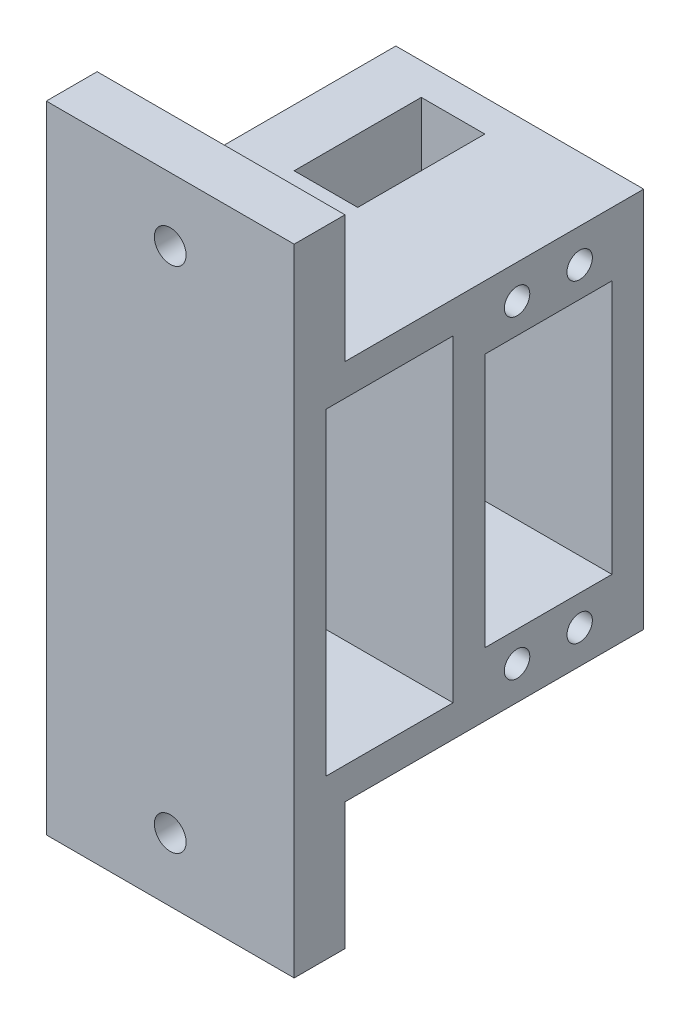
ISO-10303-21;
HEADER;
FILE_DESCRIPTION(('STEP AP214'),'2;1');
FILE_NAME('part.step','',(''),(''),'','','');
FILE_SCHEMA(('AUTOMOTIVE_DESIGN { 1 0 10303 214 1 1 1 1 }'));
ENDSEC;
DATA;
#1=APPLICATION_CONTEXT('core data for automotive mechanical design processes');
#2=APPLICATION_PROTOCOL_DEFINITION('international standard','automotive_design',2000,#1);
#3=PRODUCT_CONTEXT('',#1,'mechanical');
#4=PRODUCT('Part','Part','',(#3));
#5=PRODUCT_RELATED_PRODUCT_CATEGORY('part','',(#4));
#6=PRODUCT_DEFINITION_FORMATION('','',#4);
#7=PRODUCT_DEFINITION_CONTEXT('part definition',#1,'design');
#8=PRODUCT_DEFINITION('design','',#6,#7);
#9=PRODUCT_DEFINITION_SHAPE('','',#8);
#10=(LENGTH_UNIT() NAMED_UNIT(*) SI_UNIT(.MILLI.,.METRE.));
#11=(NAMED_UNIT(*) PLANE_ANGLE_UNIT() SI_UNIT($,.RADIAN.));
#12=(NAMED_UNIT(*) SI_UNIT($,.STERADIAN.) SOLID_ANGLE_UNIT());
#13=UNCERTAINTY_MEASURE_WITH_UNIT(LENGTH_MEASURE(1.E-05),#10,'distance_accuracy_value','');
#14=(GEOMETRIC_REPRESENTATION_CONTEXT(3) GLOBAL_UNCERTAINTY_ASSIGNED_CONTEXT((#13)) GLOBAL_UNIT_ASSIGNED_CONTEXT((#10,
#11,#12)) REPRESENTATION_CONTEXT('',''));
#15=CARTESIAN_POINT('',(0.,0.,0.));
#16=DIRECTION('',(0.,0.,1.));
#17=DIRECTION('',(1.,0.,0.));
#18=AXIS2_PLACEMENT_3D('',#15,#16,#17);
#19=CARTESIAN_POINT('',(39.,30.,15.));
#20=DIRECTION('',(0.,-1.,0.));
#21=DIRECTION('',(0.,0.,-1.));
#22=AXIS2_PLACEMENT_3D('',#19,#20,#21);
#23=PLANE('',#22);
#24=DIRECTION('',(1.,0.,0.));
#25=VECTOR('',#24,1.);
#26=CARTESIAN_POINT('',(9.,30.,10.));
#27=LINE('',#26,#25);
#28=CARTESIAN_POINT('',(9.,30.,10.));
#29=VERTEX_POINT('',#28);
#30=CARTESIAN_POINT('',(19.,30.,10.));
#31=VERTEX_POINT('',#30);
#32=EDGE_CURVE('E251',#29,#31,#27,.T.);
#33=ORIENTED_EDGE('',*,*,#32,.F.);
#34=DIRECTION('',(0.,0.,1.));
#35=VECTOR('',#34,1.);
#36=CARTESIAN_POINT('',(9.,30.,10.));
#37=LINE('',#36,#35);
#38=CARTESIAN_POINT('',(9.,30.,-9.99999999999999));
#39=VERTEX_POINT('',#38);
#40=EDGE_CURVE('E254',#39,#29,#37,.T.);
#41=ORIENTED_EDGE('',*,*,#40,.F.);
#42=DIRECTION('',(-1.,0.,0.));
#43=VECTOR('',#42,1.);
#44=CARTESIAN_POINT('',(9.,30.,-9.99999999999999));
#45=LINE('',#44,#43);
#46=CARTESIAN_POINT('',(19.,30.,-9.99999999999999));
#47=VERTEX_POINT('',#46);
#48=EDGE_CURVE('E257',#47,#39,#45,.T.);
#49=ORIENTED_EDGE('',*,*,#48,.F.);
#50=DIRECTION('',(0.,0.,-1.));
#51=VECTOR('',#50,1.);
#52=CARTESIAN_POINT('',(19.,30.,10.));
#53=LINE('',#52,#51);
#54=EDGE_CURVE('E248',#31,#47,#53,.T.);
#55=ORIENTED_EDGE('',*,*,#54,.F.);
#56=EDGE_LOOP('',(#33,#41,#49,#55));
#57=FACE_BOUND('',#56,.T.);
#58=DIRECTION('',(-1.,0.,0.));
#59=VECTOR('',#58,1.);
#60=CARTESIAN_POINT('',(39.,30.,32.));
#61=LINE('',#60,#59);
#62=CARTESIAN_POINT('',(39.,30.,32.));
#63=VERTEX_POINT('',#62);
#64=CARTESIAN_POINT('',(0.,30.,32.));
#65=VERTEX_POINT('',#64);
#66=EDGE_CURVE('E60',#63,#65,#61,.T.);
#67=ORIENTED_EDGE('',*,*,#66,.F.);
#68=DIRECTION('',(0.,0.,1.));
#69=VECTOR('',#68,1.);
#70=CARTESIAN_POINT('',(39.,30.,15.));
#71=LINE('',#70,#69);
#72=CARTESIAN_POINT('',(39.,30.,-15.));
#73=VERTEX_POINT('',#72);
#74=EDGE_CURVE('E192',#73,#63,#71,.T.);
#75=ORIENTED_EDGE('',*,*,#74,.F.);
#76=DIRECTION('',(-1.,0.,0.));
#77=VECTOR('',#76,1.);
#78=CARTESIAN_POINT('',(39.,30.,-15.));
#79=LINE('',#78,#77);
#80=CARTESIAN_POINT('',(0.,30.,-15.));
#81=VERTEX_POINT('',#80);
#82=EDGE_CURVE('E13',#73,#81,#79,.T.);
#83=ORIENTED_EDGE('',*,*,#82,.T.);
#84=DIRECTION('',(0.,0.,1.));
#85=VECTOR('',#84,1.);
#86=CARTESIAN_POINT('',(0.,30.,15.));
#87=LINE('',#86,#85);
#88=EDGE_CURVE('E326',#81,#65,#87,.T.);
#89=ORIENTED_EDGE('',*,*,#88,.T.);
#90=EDGE_LOOP('',(#67,#75,#83,#89));
#91=FACE_BOUND('',#90,.T.);
#92=ADVANCED_FACE('F45',(#57,#91),#23,.F.);
#93=CARTESIAN_POINT('',(39.,-30.,15.));
#94=DIRECTION('',(0.,1.,0.));
#95=DIRECTION('',(0.,0.,1.));
#96=AXIS2_PLACEMENT_3D('',#93,#94,#95);
#97=PLANE('',#96);
#98=DIRECTION('',(1.,0.,0.));
#99=VECTOR('',#98,1.);
#100=CARTESIAN_POINT('',(39.,-30.,32.));
#101=LINE('',#100,#99);
#102=CARTESIAN_POINT('',(0.,-30.,32.));
#103=VERTEX_POINT('',#102);
#104=CARTESIAN_POINT('',(39.,-30.,32.));
#105=VERTEX_POINT('',#104);
#106=EDGE_CURVE('E68',#103,#105,#101,.T.);
#107=ORIENTED_EDGE('',*,*,#106,.F.);
#108=DIRECTION('',(0.,0.,-1.));
#109=VECTOR('',#108,1.);
#110=CARTESIAN_POINT('',(0.,-30.,15.));
#111=LINE('',#110,#109);
#112=CARTESIAN_POINT('',(0.,-30.,-15.));
#113=VERTEX_POINT('',#112);
#114=EDGE_CURVE('E320',#103,#113,#111,.T.);
#115=ORIENTED_EDGE('',*,*,#114,.T.);
#116=DIRECTION('',(-1.,0.,0.));
#117=VECTOR('',#116,1.);
#118=CARTESIAN_POINT('',(39.,-30.,-15.));
#119=LINE('',#118,#117);
#120=CARTESIAN_POINT('',(39.,-30.,-15.));
#121=VERTEX_POINT('',#120);
#122=EDGE_CURVE('E53',#121,#113,#119,.T.);
#123=ORIENTED_EDGE('',*,*,#122,.F.);
#124=DIRECTION('',(0.,0.,-1.));
#125=VECTOR('',#124,1.);
#126=CARTESIAN_POINT('',(39.,-30.,15.));
#127=LINE('',#126,#125);
#128=EDGE_CURVE('E322',#105,#121,#127,.T.);
#129=ORIENTED_EDGE('',*,*,#128,.F.);
#130=EDGE_LOOP('',(#107,#115,#123,#129));
#131=FACE_BOUND('',#130,.T.);
#132=ADVANCED_FACE('F339',(#131),#97,.F.);
#133=CARTESIAN_POINT('',(39.,30.,-15.));
#134=DIRECTION('',(0.,0.,1.));
#135=DIRECTION('',(0.,-1.,0.));
#136=AXIS2_PLACEMENT_3D('',#133,#134,#135);
#137=PLANE('',#136);
#138=DIRECTION('',(0.,1.,0.));
#139=VECTOR('',#138,1.);
#140=CARTESIAN_POINT('',(0.,30.,-15.));
#141=LINE('',#140,#139);
#142=EDGE_CURVE('E312',#113,#81,#141,.T.);
#143=ORIENTED_EDGE('',*,*,#142,.T.);
#144=ORIENTED_EDGE('',*,*,#82,.F.);
#145=DIRECTION('',(0.,1.,0.));
#146=VECTOR('',#145,1.);
#147=CARTESIAN_POINT('',(39.,30.,-15.));
#148=LINE('',#147,#146);
#149=EDGE_CURVE('E318',#121,#73,#148,.T.);
#150=ORIENTED_EDGE('',*,*,#149,.F.);
#151=ORIENTED_EDGE('',*,*,#122,.T.);
#152=EDGE_LOOP('',(#143,#144,#150,#151));
#153=FACE_BOUND('',#152,.T.);
#154=ADVANCED_FACE('F47',(#153),#137,.F.);
#155=CARTESIAN_POINT('',(39.,0.,0.));
#156=DIRECTION('',(1.,0.,0.));
#157=DIRECTION('',(0.,0.,-1.));
#158=AXIS2_PLACEMENT_3D('',#155,#156,#157);
#159=PLANE('',#158);
#160=DIRECTION('',(0.,-1.,0.));
#161=VECTOR('',#160,1.);
#162=CARTESIAN_POINT('',(39.,25.,35.));
#163=LINE('',#162,#161);
#164=CARTESIAN_POINT('',(39.,25.,35.));
#165=VERTEX_POINT('',#164);
#166=CARTESIAN_POINT('',(39.,-25.,35.));
#167=VERTEX_POINT('',#166);
#168=EDGE_CURVE('E214',#165,#167,#163,.T.);
#169=ORIENTED_EDGE('',*,*,#168,.F.);
#170=DIRECTION('',(0.,0.,1.));
#171=VECTOR('',#170,1.);
#172=CARTESIAN_POINT('',(39.,25.,35.));
#173=LINE('',#172,#171);
#174=CARTESIAN_POINT('',(39.,25.,15.));
#175=VERTEX_POINT('',#174);
#176=EDGE_CURVE('E231',#175,#165,#173,.T.);
#177=ORIENTED_EDGE('',*,*,#176,.F.);
#178=DIRECTION('',(0.,1.,0.));
#179=VECTOR('',#178,1.);
#180=CARTESIAN_POINT('',(39.,25.,15.));
#181=LINE('',#180,#179);
#182=CARTESIAN_POINT('',(39.,-25.,15.));
#183=VERTEX_POINT('',#182);
#184=EDGE_CURVE('E228',#183,#175,#181,.T.);
#185=ORIENTED_EDGE('',*,*,#184,.F.);
#186=DIRECTION('',(0.,0.,-1.));
#187=VECTOR('',#186,1.);
#188=CARTESIAN_POINT('',(39.,-25.,35.));
#189=LINE('',#188,#187);
#190=EDGE_CURVE('E225',#167,#183,#189,.T.);
#191=ORIENTED_EDGE('',*,*,#190,.F.);
#192=EDGE_LOOP('',(#169,#177,#185,#191));
#193=FACE_BOUND('',#192,.T.);
#194=CARTESIAN_POINT('',(39.,-24.71,4.925));
#195=DIRECTION('',(1.,0.,0.));
#196=DIRECTION('',(0.,0.,1.));
#197=AXIS2_PLACEMENT_3D('',#194,#195,#196);
#198=CIRCLE('',#197,2.);
#199=CARTESIAN_POINT('',(39.,-24.71,6.925));
#200=VERTEX_POINT('',#199);
#201=EDGE_CURVE('E282',#200,#200,#198,.T.);
#202=ORIENTED_EDGE('',*,*,#201,.F.);
#203=EDGE_LOOP('',(#202));
#204=FACE_BOUND('',#203,.T.);
#205=CARTESIAN_POINT('',(39.,-24.71,-4.925));
#206=DIRECTION('',(1.,0.,0.));
#207=DIRECTION('',(0.,0.,1.));
#208=AXIS2_PLACEMENT_3D('',#205,#206,#207);
#209=CIRCLE('',#208,2.);
#210=CARTESIAN_POINT('',(39.,-24.71,-2.925));
#211=VERTEX_POINT('',#210);
#212=EDGE_CURVE('E276',#211,#211,#209,.T.);
#213=ORIENTED_EDGE('',*,*,#212,.F.);
#214=EDGE_LOOP('',(#213));
#215=FACE_BOUND('',#214,.T.);
#216=CARTESIAN_POINT('',(39.,24.71,-4.925));
#217=DIRECTION('',(1.,0.,0.));
#218=DIRECTION('',(0.,0.,-1.));
#219=AXIS2_PLACEMENT_3D('',#216,#217,#218);
#220=CIRCLE('',#219,2.00000000000001);
#221=CARTESIAN_POINT('',(39.,24.71,-6.92500000000001));
#222=VERTEX_POINT('',#221);
#223=EDGE_CURVE('E269',#222,#222,#220,.T.);
#224=ORIENTED_EDGE('',*,*,#223,.F.);
#225=EDGE_LOOP('',(#224));
#226=FACE_BOUND('',#225,.T.);
#227=CARTESIAN_POINT('',(39.,24.71,4.925));
#228=DIRECTION('',(1.,0.,0.));
#229=DIRECTION('',(0.,0.,-1.));
#230=AXIS2_PLACEMENT_3D('',#227,#228,#229);
#231=CIRCLE('',#230,2.);
#232=CARTESIAN_POINT('',(39.,24.71,2.92499999999999));
#233=VERTEX_POINT('',#232);
#234=EDGE_CURVE('E272',#233,#233,#231,.T.);
#235=ORIENTED_EDGE('',*,*,#234,.F.);
#236=EDGE_LOOP('',(#235));
#237=FACE_BOUND('',#236,.T.);
#238=DIRECTION('',(0.,1.,0.));
#239=VECTOR('',#238,1.);
#240=CARTESIAN_POINT('',(39.,20.,-9.99999999999999));
#241=LINE('',#240,#239);
#242=CARTESIAN_POINT('',(39.,-20.,-10.));
#243=VERTEX_POINT('',#242);
#244=CARTESIAN_POINT('',(39.,20.,-9.99999999999999));
#245=VERTEX_POINT('',#244);
#246=EDGE_CURVE('E289',#243,#245,#241,.T.);
#247=ORIENTED_EDGE('',*,*,#246,.F.);
#248=DIRECTION('',(0.,0.,-1.));
#249=VECTOR('',#248,1.);
#250=CARTESIAN_POINT('',(39.,-20.,10.));
#251=LINE('',#250,#249);
#252=CARTESIAN_POINT('',(39.,-20.,10.));
#253=VERTEX_POINT('',#252);
#254=EDGE_CURVE('E293',#253,#243,#251,.T.);
#255=ORIENTED_EDGE('',*,*,#254,.F.);
#256=DIRECTION('',(0.,-1.,0.));
#257=VECTOR('',#256,1.);
#258=CARTESIAN_POINT('',(39.,20.,10.));
#259=LINE('',#258,#257);
#260=CARTESIAN_POINT('',(39.,20.,10.));
#261=VERTEX_POINT('',#260);
#262=EDGE_CURVE('E305',#261,#253,#259,.T.);
#263=ORIENTED_EDGE('',*,*,#262,.F.);
#264=DIRECTION('',(0.,0.,1.));
#265=VECTOR('',#264,1.);
#266=CARTESIAN_POINT('',(39.,20.,10.));
#267=LINE('',#266,#265);
#268=EDGE_CURVE('E302',#245,#261,#267,.T.);
#269=ORIENTED_EDGE('',*,*,#268,.F.);
#270=EDGE_LOOP('',(#247,#255,#263,#269));
#271=FACE_BOUND('',#270,.T.);
#272=ORIENTED_EDGE('',*,*,#149,.T.);
#273=ORIENTED_EDGE('',*,*,#74,.T.);
#274=DIRECTION('',(0.,-1.,0.));
#275=VECTOR('',#274,1.);
#276=CARTESIAN_POINT('',(39.,50.,32.));
#277=LINE('',#276,#275);
#278=CARTESIAN_POINT('',(39.,50.,32.));
#279=VERTEX_POINT('',#278);
#280=EDGE_CURVE('E174',#279,#63,#277,.T.);
#281=ORIENTED_EDGE('',*,*,#280,.F.);
#282=DIRECTION('',(0.,0.,-1.));
#283=VECTOR('',#282,1.);
#284=CARTESIAN_POINT('',(39.,50.,40.));
#285=LINE('',#284,#283);
#286=CARTESIAN_POINT('',(39.,50.,40.));
#287=VERTEX_POINT('',#286);
#288=EDGE_CURVE('E181',#287,#279,#285,.T.);
#289=ORIENTED_EDGE('',*,*,#288,.F.);
#290=DIRECTION('',(0.,1.,0.));
#291=VECTOR('',#290,1.);
#292=CARTESIAN_POINT('',(39.,30.,40.));
#293=LINE('',#292,#291);
#294=CARTESIAN_POINT('',(39.,-50.,40.));
#295=VERTEX_POINT('',#294);
#296=EDGE_CURVE('E245',#295,#287,#293,.T.);
#297=ORIENTED_EDGE('',*,*,#296,.F.);
#298=DIRECTION('',(0.,0.,1.));
#299=VECTOR('',#298,1.);
#300=CARTESIAN_POINT('',(39.,-50.,32.));
#301=LINE('',#300,#299);
#302=CARTESIAN_POINT('',(39.,-50.,32.));
#303=VERTEX_POINT('',#302);
#304=EDGE_CURVE('E194',#303,#295,#301,.T.);
#305=ORIENTED_EDGE('',*,*,#304,.F.);
#306=DIRECTION('',(0.,1.,0.));
#307=VECTOR('',#306,1.);
#308=CARTESIAN_POINT('',(39.,-50.,32.));
#309=LINE('',#308,#307);
#310=EDGE_CURVE('E207',#303,#105,#309,.T.);
#311=ORIENTED_EDGE('',*,*,#310,.T.);
#312=ORIENTED_EDGE('',*,*,#128,.T.);
#313=EDGE_LOOP('',(#272,#273,#281,#289,#297,#305,#311,#312));
#314=FACE_BOUND('',#313,.T.);
#315=ADVANCED_FACE('F191',(#193,#204,#215,#226,#237,#271,#314),#159,.T.);
#316=CARTESIAN_POINT('',(0.,0.,0.));
#317=DIRECTION('',(1.,0.,0.));
#318=DIRECTION('',(0.,0.,-1.));
#319=AXIS2_PLACEMENT_3D('',#316,#317,#318);
#320=PLANE('',#319);
#321=DIRECTION('',(0.,0.,-1.));
#322=VECTOR('',#321,1.);
#323=CARTESIAN_POINT('',(0.,25.,35.));
#324=LINE('',#323,#322);
#325=CARTESIAN_POINT('',(0.,25.,35.));
#326=VERTEX_POINT('',#325);
#327=CARTESIAN_POINT('',(0.,25.,15.));
#328=VERTEX_POINT('',#327);
#329=EDGE_CURVE('E218',#326,#328,#324,.T.);
#330=ORIENTED_EDGE('',*,*,#329,.F.);
#331=DIRECTION('',(0.,1.,0.));
#332=VECTOR('',#331,1.);
#333=CARTESIAN_POINT('',(0.,25.,35.));
#334=LINE('',#333,#332);
#335=CARTESIAN_POINT('',(0.,-25.,35.));
#336=VERTEX_POINT('',#335);
#337=EDGE_CURVE('E221',#336,#326,#334,.T.);
#338=ORIENTED_EDGE('',*,*,#337,.F.);
#339=DIRECTION('',(0.,0.,1.));
#340=VECTOR('',#339,1.);
#341=CARTESIAN_POINT('',(0.,-25.,35.));
#342=LINE('',#341,#340);
#343=CARTESIAN_POINT('',(0.,-25.,15.));
#344=VERTEX_POINT('',#343);
#345=EDGE_CURVE('E223',#344,#336,#342,.T.);
#346=ORIENTED_EDGE('',*,*,#345,.F.);
#347=DIRECTION('',(0.,-1.,0.));
#348=VECTOR('',#347,1.);
#349=CARTESIAN_POINT('',(0.,25.,15.));
#350=LINE('',#349,#348);
#351=EDGE_CURVE('E215',#328,#344,#350,.T.);
#352=ORIENTED_EDGE('',*,*,#351,.F.);
#353=EDGE_LOOP('',(#330,#338,#346,#352));
#354=FACE_BOUND('',#353,.T.);
#355=ORIENTED_EDGE('',*,*,#142,.F.);
#356=ORIENTED_EDGE('',*,*,#114,.F.);
#357=DIRECTION('',(0.,1.,0.));
#358=VECTOR('',#357,1.);
#359=CARTESIAN_POINT('',(0.,-50.,32.));
#360=LINE('',#359,#358);
#361=CARTESIAN_POINT('',(0.,-50.,32.));
#362=VERTEX_POINT('',#361);
#363=EDGE_CURVE('E211',#362,#103,#360,.T.);
#364=ORIENTED_EDGE('',*,*,#363,.F.);
#365=DIRECTION('',(0.,0.,-1.));
#366=VECTOR('',#365,1.);
#367=CARTESIAN_POINT('',(0.,-50.,32.));
#368=LINE('',#367,#366);
#369=CARTESIAN_POINT('',(0.,-50.,40.));
#370=VERTEX_POINT('',#369);
#371=EDGE_CURVE('E204',#370,#362,#368,.T.);
#372=ORIENTED_EDGE('',*,*,#371,.F.);
#373=DIRECTION('',(0.,-1.,0.));
#374=VECTOR('',#373,1.);
#375=CARTESIAN_POINT('',(0.,30.,40.));
#376=LINE('',#375,#374);
#377=CARTESIAN_POINT('',(0.,50.,40.));
#378=VERTEX_POINT('',#377);
#379=EDGE_CURVE('E243',#378,#370,#376,.T.);
#380=ORIENTED_EDGE('',*,*,#379,.F.);
#381=DIRECTION('',(0.,0.,1.));
#382=VECTOR('',#381,1.);
#383=CARTESIAN_POINT('',(0.,50.,40.));
#384=LINE('',#383,#382);
#385=CARTESIAN_POINT('',(0.,50.,32.));
#386=VERTEX_POINT('',#385);
#387=EDGE_CURVE('E180',#386,#378,#384,.T.);
#388=ORIENTED_EDGE('',*,*,#387,.F.);
#389=DIRECTION('',(0.,-1.,0.));
#390=VECTOR('',#389,1.);
#391=CARTESIAN_POINT('',(0.,50.,32.));
#392=LINE('',#391,#390);
#393=EDGE_CURVE('E176',#386,#65,#392,.T.);
#394=ORIENTED_EDGE('',*,*,#393,.T.);
#395=ORIENTED_EDGE('',*,*,#88,.F.);
#396=EDGE_LOOP('',(#355,#356,#364,#372,#380,#388,#394,#395));
#397=FACE_BOUND('',#396,.T.);
#398=ADVANCED_FACE('F335',(#354,#397),#320,.F.);
#399=CARTESIAN_POINT('',(9.,20.,-9.99999999999999));
#400=DIRECTION('',(0.,0.,-1.));
#401=DIRECTION('',(0.,1.,0.));
#402=AXIS2_PLACEMENT_3D('',#399,#400,#401);
#403=PLANE('',#402);
#404=ORIENTED_EDGE('',*,*,#246,.T.);
#405=DIRECTION('',(1.,0.,0.));
#406=VECTOR('',#405,1.);
#407=CARTESIAN_POINT('',(9.,20.,-9.99999999999999));
#408=LINE('',#407,#406);
#409=CARTESIAN_POINT('',(19.,20.,-9.99999999999999));
#410=VERTEX_POINT('',#409);
#411=EDGE_CURVE('E299',#410,#245,#408,.T.);
#412=ORIENTED_EDGE('',*,*,#411,.F.);
#413=DIRECTION('',(0.,-1.,0.));
#414=VECTOR('',#413,1.);
#415=CARTESIAN_POINT('',(19.,52.3606797749979,-9.99999999999999));
#416=LINE('',#415,#414);
#417=EDGE_CURVE('E260',#47,#410,#416,.T.);
#418=ORIENTED_EDGE('',*,*,#417,.F.);
#419=ORIENTED_EDGE('',*,*,#48,.T.);
#420=DIRECTION('',(0.,1.,0.));
#421=VECTOR('',#420,1.);
#422=CARTESIAN_POINT('',(9.,20.,-9.99999999999999));
#423=LINE('',#422,#421);
#424=CARTESIAN_POINT('',(9.,-20.,-10.));
#425=VERTEX_POINT('',#424);
#426=EDGE_CURVE('E290',#425,#39,#423,.T.);
#427=ORIENTED_EDGE('',*,*,#426,.F.);
#428=DIRECTION('',(1.,0.,0.));
#429=VECTOR('',#428,1.);
#430=CARTESIAN_POINT('',(9.,-20.,-10.));
#431=LINE('',#430,#429);
#432=EDGE_CURVE('E310',#425,#243,#431,.T.);
#433=ORIENTED_EDGE('',*,*,#432,.T.);
#434=EDGE_LOOP('',(#404,#412,#418,#419,#427,#433));
#435=FACE_BOUND('',#434,.T.);
#436=ADVANCED_FACE('F391',(#435),#403,.F.);
#437=CARTESIAN_POINT('',(9.,-20.,10.));
#438=DIRECTION('',(0.,-1.,0.));
#439=DIRECTION('',(0.,0.,-1.));
#440=AXIS2_PLACEMENT_3D('',#437,#438,#439);
#441=PLANE('',#440);
#442=ORIENTED_EDGE('',*,*,#254,.T.);
#443=ORIENTED_EDGE('',*,*,#432,.F.);
#444=DIRECTION('',(0.,0.,-1.));
#445=VECTOR('',#444,1.);
#446=CARTESIAN_POINT('',(9.,-20.,10.));
#447=LINE('',#446,#445);
#448=CARTESIAN_POINT('',(9.,-20.,10.));
#449=VERTEX_POINT('',#448);
#450=EDGE_CURVE('E296',#449,#425,#447,.T.);
#451=ORIENTED_EDGE('',*,*,#450,.F.);
#452=DIRECTION('',(1.,0.,0.));
#453=VECTOR('',#452,1.);
#454=CARTESIAN_POINT('',(9.,-20.,10.));
#455=LINE('',#454,#453);
#456=EDGE_CURVE('E313',#449,#253,#455,.T.);
#457=ORIENTED_EDGE('',*,*,#456,.T.);
#458=EDGE_LOOP('',(#442,#443,#451,#457));
#459=FACE_BOUND('',#458,.T.);
#460=ADVANCED_FACE('F398',(#459),#441,.F.);
#461=CARTESIAN_POINT('',(9.,20.,10.));
#462=DIRECTION('',(0.,0.,1.));
#463=DIRECTION('',(0.,-1.,0.));
#464=AXIS2_PLACEMENT_3D('',#461,#462,#463);
#465=PLANE('',#464);
#466=ORIENTED_EDGE('',*,*,#262,.T.);
#467=ORIENTED_EDGE('',*,*,#456,.F.);
#468=DIRECTION('',(0.,-1.,0.));
#469=VECTOR('',#468,1.);
#470=CARTESIAN_POINT('',(9.,20.,10.));
#471=LINE('',#470,#469);
#472=EDGE_CURVE('E292',#29,#449,#471,.T.);
#473=ORIENTED_EDGE('',*,*,#472,.F.);
#474=ORIENTED_EDGE('',*,*,#32,.T.);
#475=DIRECTION('',(0.,-1.,0.));
#476=VECTOR('',#475,1.);
#477=CARTESIAN_POINT('',(19.,52.3606797749979,10.));
#478=LINE('',#477,#476);
#479=CARTESIAN_POINT('',(19.,20.,10.));
#480=VERTEX_POINT('',#479);
#481=EDGE_CURVE('E252',#31,#480,#478,.T.);
#482=ORIENTED_EDGE('',*,*,#481,.T.);
#483=DIRECTION('',(1.,0.,0.));
#484=VECTOR('',#483,1.);
#485=CARTESIAN_POINT('',(9.,20.,10.));
#486=LINE('',#485,#484);
#487=EDGE_CURVE('E315',#480,#261,#486,.T.);
#488=ORIENTED_EDGE('',*,*,#487,.T.);
#489=EDGE_LOOP('',(#466,#467,#473,#474,#482,#488));
#490=FACE_BOUND('',#489,.T.);
#491=ADVANCED_FACE('F404',(#490),#465,.F.);
#492=CARTESIAN_POINT('',(9.,20.,10.));
#493=DIRECTION('',(0.,1.,0.));
#494=DIRECTION('',(0.,0.,1.));
#495=AXIS2_PLACEMENT_3D('',#492,#493,#494);
#496=PLANE('',#495);
#497=ORIENTED_EDGE('',*,*,#487,.F.);
#498=DIRECTION('',(0.,0.,1.));
#499=VECTOR('',#498,1.);
#500=CARTESIAN_POINT('',(19.,20.,10.));
#501=LINE('',#500,#499);
#502=EDGE_CURVE('E247',#410,#480,#501,.T.);
#503=ORIENTED_EDGE('',*,*,#502,.F.);
#504=ORIENTED_EDGE('',*,*,#411,.T.);
#505=ORIENTED_EDGE('',*,*,#268,.T.);
#506=EDGE_LOOP('',(#497,#503,#504,#505));
#507=FACE_BOUND('',#506,.T.);
#508=ADVANCED_FACE('F400',(#507),#496,.F.);
#509=CARTESIAN_POINT('',(9.,0.,0.));
#510=DIRECTION('',(1.,0.,0.));
#511=DIRECTION('',(0.,0.,-1.));
#512=AXIS2_PLACEMENT_3D('',#509,#510,#511);
#513=PLANE('',#512);
#514=ORIENTED_EDGE('',*,*,#426,.T.);
#515=ORIENTED_EDGE('',*,*,#40,.T.);
#516=ORIENTED_EDGE('',*,*,#472,.T.);
#517=ORIENTED_EDGE('',*,*,#450,.T.);
#518=EDGE_LOOP('',(#514,#515,#516,#517));
#519=FACE_BOUND('',#518,.T.);
#520=ADVANCED_FACE('F403',(#519),#513,.T.);
#521=CARTESIAN_POINT('',(19.,24.71,4.925));
#522=DIRECTION('',(1.,0.,0.));
#523=DIRECTION('',(0.,0.,-1.));
#524=AXIS2_PLACEMENT_3D('',#521,#522,#523);
#525=CYLINDRICAL_SURFACE('',#524,2.);
#526=CARTESIAN_POINT('',(19.,24.71,4.925));
#527=DIRECTION('',(1.,0.,0.));
#528=DIRECTION('',(0.,0.,-1.));
#529=AXIS2_PLACEMENT_3D('',#526,#527,#528);
#530=CIRCLE('',#529,2.);
#531=CARTESIAN_POINT('',(19.,24.71,2.92499999999999));
#532=VERTEX_POINT('',#531);
#533=EDGE_CURVE('E268',#532,#532,#530,.T.);
#534=ORIENTED_EDGE('',*,*,#533,.F.);
#535=EDGE_LOOP('',(#534));
#536=FACE_BOUND('',#535,.T.);
#537=ORIENTED_EDGE('',*,*,#234,.T.);
#538=EDGE_LOOP('',(#537));
#539=FACE_BOUND('',#538,.T.);
#540=ADVANCED_FACE('F414',(#536,#539),#525,.F.);
#541=CARTESIAN_POINT('',(19.,24.71,-4.925));
#542=DIRECTION('',(1.,0.,0.));
#543=DIRECTION('',(0.,0.,-1.));
#544=AXIS2_PLACEMENT_3D('',#541,#542,#543);
#545=CYLINDRICAL_SURFACE('',#544,2.00000000000001);
#546=CARTESIAN_POINT('',(19.,24.71,-4.925));
#547=DIRECTION('',(1.,0.,0.));
#548=DIRECTION('',(0.,0.,-1.));
#549=AXIS2_PLACEMENT_3D('',#546,#547,#548);
#550=CIRCLE('',#549,2.00000000000001);
#551=CARTESIAN_POINT('',(19.,24.71,-6.92500000000001));
#552=VERTEX_POINT('',#551);
#553=EDGE_CURVE('E265',#552,#552,#550,.T.);
#554=ORIENTED_EDGE('',*,*,#553,.F.);
#555=EDGE_LOOP('',(#554));
#556=FACE_BOUND('',#555,.T.);
#557=ORIENTED_EDGE('',*,*,#223,.T.);
#558=EDGE_LOOP('',(#557));
#559=FACE_BOUND('',#558,.T.);
#560=ADVANCED_FACE('F418',(#556,#559),#545,.F.);
#561=CARTESIAN_POINT('',(19.,-24.71,-4.925));
#562=DIRECTION('',(1.,0.,0.));
#563=DIRECTION('',(0.,0.,-1.));
#564=AXIS2_PLACEMENT_3D('',#561,#562,#563);
#565=CYLINDRICAL_SURFACE('',#564,2.);
#566=CARTESIAN_POINT('',(19.,-24.71,-4.925));
#567=DIRECTION('',(1.,0.,0.));
#568=DIRECTION('',(0.,0.,1.));
#569=AXIS2_PLACEMENT_3D('',#566,#567,#568);
#570=CIRCLE('',#569,2.);
#571=CARTESIAN_POINT('',(19.,-24.71,-2.925));
#572=VERTEX_POINT('',#571);
#573=EDGE_CURVE('E273',#572,#572,#570,.T.);
#574=ORIENTED_EDGE('',*,*,#573,.F.);
#575=EDGE_LOOP('',(#574));
#576=FACE_BOUND('',#575,.T.);
#577=ORIENTED_EDGE('',*,*,#212,.T.);
#578=EDGE_LOOP('',(#577));
#579=FACE_BOUND('',#578,.T.);
#580=ADVANCED_FACE('F430',(#576,#579),#565,.F.);
#581=CARTESIAN_POINT('',(19.,-24.71,-4.925));
#582=DIRECTION('',(-1.,0.,0.));
#583=DIRECTION('',(0.,0.,1.));
#584=AXIS2_PLACEMENT_3D('',#581,#582,#583);
#585=PLANE('',#584);
#586=ORIENTED_EDGE('',*,*,#573,.T.);
#587=EDGE_LOOP('',(#586));
#588=FACE_BOUND('',#587,.T.);
#589=ADVANCED_FACE('F424',(#588),#585,.F.);
#590=CARTESIAN_POINT('',(19.,-24.71,4.925));
#591=DIRECTION('',(1.,0.,0.));
#592=DIRECTION('',(0.,0.,-1.));
#593=AXIS2_PLACEMENT_3D('',#590,#591,#592);
#594=CYLINDRICAL_SURFACE('',#593,2.);
#595=CARTESIAN_POINT('',(19.,-24.71,4.925));
#596=DIRECTION('',(1.,0.,0.));
#597=DIRECTION('',(0.,0.,1.));
#598=AXIS2_PLACEMENT_3D('',#595,#596,#597);
#599=CIRCLE('',#598,2.);
#600=CARTESIAN_POINT('',(19.,-24.71,6.925));
#601=VERTEX_POINT('',#600);
#602=EDGE_CURVE('E279',#601,#601,#599,.T.);
#603=ORIENTED_EDGE('',*,*,#602,.F.);
#604=EDGE_LOOP('',(#603));
#605=FACE_BOUND('',#604,.T.);
#606=ORIENTED_EDGE('',*,*,#201,.T.);
#607=EDGE_LOOP('',(#606));
#608=FACE_BOUND('',#607,.T.);
#609=ADVANCED_FACE('F420',(#605,#608),#594,.F.);
#610=CARTESIAN_POINT('',(19.,-24.71,4.925));
#611=DIRECTION('',(-1.,0.,0.));
#612=DIRECTION('',(0.,0.,1.));
#613=AXIS2_PLACEMENT_3D('',#610,#611,#612);
#614=PLANE('',#613);
#615=ORIENTED_EDGE('',*,*,#602,.T.);
#616=EDGE_LOOP('',(#615));
#617=FACE_BOUND('',#616,.T.);
#618=ADVANCED_FACE('F423',(#617),#614,.F.);
#619=CARTESIAN_POINT('',(19.,52.3606797749979,10.));
#620=DIRECTION('',(1.,0.,0.));
#621=DIRECTION('',(0.,0.,-1.));
#622=AXIS2_PLACEMENT_3D('',#619,#620,#621);
#623=PLANE('',#622);
#624=ORIENTED_EDGE('',*,*,#533,.T.);
#625=EDGE_LOOP('',(#624));
#626=FACE_BOUND('',#625,.T.);
#627=ORIENTED_EDGE('',*,*,#553,.T.);
#628=EDGE_LOOP('',(#627));
#629=FACE_BOUND('',#628,.T.);
#630=ORIENTED_EDGE('',*,*,#54,.T.);
#631=ORIENTED_EDGE('',*,*,#417,.T.);
#632=ORIENTED_EDGE('',*,*,#502,.T.);
#633=ORIENTED_EDGE('',*,*,#481,.F.);
#634=EDGE_LOOP('',(#630,#631,#632,#633));
#635=FACE_BOUND('',#634,.T.);
#636=ADVANCED_FACE('F428',(#626,#629,#635),#623,.F.);
#637=CARTESIAN_POINT('',(0.,0.,40.));
#638=DIRECTION('',(0.,0.,1.));
#639=DIRECTION('',(1.,0.,0.));
#640=AXIS2_PLACEMENT_3D('',#637,#638,#639);
#641=PLANE('',#640);
#642=CARTESIAN_POINT('',(19.5,-40.,40.));
#643=DIRECTION('',(0.,0.,1.));
#644=DIRECTION('',(1.,0.,0.));
#645=AXIS2_PLACEMENT_3D('',#642,#643,#644);
#646=CIRCLE('',#645,2.5);
#647=CARTESIAN_POINT('',(22.,-40.,40.));
#648=VERTEX_POINT('',#647);
#649=EDGE_CURVE('E351',#648,#648,#646,.F.);
#650=ORIENTED_EDGE('',*,*,#649,.T.);
#651=EDGE_LOOP('',(#650));
#652=FACE_BOUND('',#651,.T.);
#653=CARTESIAN_POINT('',(19.5,40.,40.));
#654=DIRECTION('',(0.,0.,1.));
#655=DIRECTION('',(1.,0.,0.));
#656=AXIS2_PLACEMENT_3D('',#653,#654,#655);
#657=CIRCLE('',#656,2.5);
#658=CARTESIAN_POINT('',(22.,40.,40.));
#659=VERTEX_POINT('',#658);
#660=EDGE_CURVE('E358',#659,#659,#657,.F.);
#661=ORIENTED_EDGE('',*,*,#660,.T.);
#662=EDGE_LOOP('',(#661));
#663=FACE_BOUND('',#662,.T.);
#664=ORIENTED_EDGE('',*,*,#379,.T.);
#665=DIRECTION('',(-1.,0.,0.));
#666=VECTOR('',#665,1.);
#667=CARTESIAN_POINT('',(39.,-50.,40.));
#668=LINE('',#667,#666);
#669=EDGE_CURVE('E201',#295,#370,#668,.T.);
#670=ORIENTED_EDGE('',*,*,#669,.F.);
#671=ORIENTED_EDGE('',*,*,#296,.T.);
#672=DIRECTION('',(1.,0.,0.));
#673=VECTOR('',#672,1.);
#674=CARTESIAN_POINT('',(39.,50.,40.));
#675=LINE('',#674,#673);
#676=EDGE_CURVE('E187',#378,#287,#675,.T.);
#677=ORIENTED_EDGE('',*,*,#676,.F.);
#678=EDGE_LOOP('',(#664,#670,#671,#677));
#679=FACE_BOUND('',#678,.T.);
#680=ADVANCED_FACE('F348',(#652,#663,#679),#641,.T.);
#681=CARTESIAN_POINT('',(-53.851648071345,25.,35.));
#682=DIRECTION('',(0.,0.,1.));
#683=DIRECTION('',(0.,-1.,0.));
#684=AXIS2_PLACEMENT_3D('',#681,#682,#683);
#685=PLANE('',#684);
#686=ORIENTED_EDGE('',*,*,#337,.T.);
#687=DIRECTION('',(1.,0.,0.));
#688=VECTOR('',#687,1.);
#689=CARTESIAN_POINT('',(-53.851648071345,25.,35.));
#690=LINE('',#689,#688);
#691=EDGE_CURVE('E219',#326,#165,#690,.T.);
#692=ORIENTED_EDGE('',*,*,#691,.T.);
#693=ORIENTED_EDGE('',*,*,#168,.T.);
#694=DIRECTION('',(1.,0.,0.));
#695=VECTOR('',#694,1.);
#696=CARTESIAN_POINT('',(-53.851648071345,-25.,35.));
#697=LINE('',#696,#695);
#698=EDGE_CURVE('E234',#336,#167,#697,.T.);
#699=ORIENTED_EDGE('',*,*,#698,.F.);
#700=EDGE_LOOP('',(#686,#692,#693,#699));
#701=FACE_BOUND('',#700,.T.);
#702=ADVANCED_FACE('F444',(#701),#685,.F.);
#703=CARTESIAN_POINT('',(-53.851648071345,25.,35.));
#704=DIRECTION('',(0.,1.,0.));
#705=DIRECTION('',(0.,0.,1.));
#706=AXIS2_PLACEMENT_3D('',#703,#704,#705);
#707=PLANE('',#706);
#708=ORIENTED_EDGE('',*,*,#329,.T.);
#709=DIRECTION('',(1.,0.,0.));
#710=VECTOR('',#709,1.);
#711=CARTESIAN_POINT('',(-53.851648071345,25.,15.));
#712=LINE('',#711,#710);
#713=EDGE_CURVE('E236',#328,#175,#712,.T.);
#714=ORIENTED_EDGE('',*,*,#713,.T.);
#715=ORIENTED_EDGE('',*,*,#176,.T.);
#716=ORIENTED_EDGE('',*,*,#691,.F.);
#717=EDGE_LOOP('',(#708,#714,#715,#716));
#718=FACE_BOUND('',#717,.T.);
#719=ADVANCED_FACE('F447',(#718),#707,.F.);
#720=CARTESIAN_POINT('',(-53.851648071345,25.,15.));
#721=DIRECTION('',(0.,0.,-1.));
#722=DIRECTION('',(0.,1.,0.));
#723=AXIS2_PLACEMENT_3D('',#720,#721,#722);
#724=PLANE('',#723);
#725=ORIENTED_EDGE('',*,*,#351,.T.);
#726=DIRECTION('',(1.,0.,0.));
#727=VECTOR('',#726,1.);
#728=CARTESIAN_POINT('',(-53.851648071345,-25.,15.));
#729=LINE('',#728,#727);
#730=EDGE_CURVE('E238',#344,#183,#729,.T.);
#731=ORIENTED_EDGE('',*,*,#730,.T.);
#732=ORIENTED_EDGE('',*,*,#184,.T.);
#733=ORIENTED_EDGE('',*,*,#713,.F.);
#734=EDGE_LOOP('',(#725,#731,#732,#733));
#735=FACE_BOUND('',#734,.T.);
#736=ADVANCED_FACE('F452',(#735),#724,.F.);
#737=CARTESIAN_POINT('',(-53.851648071345,-25.,35.));
#738=DIRECTION('',(0.,-1.,0.));
#739=DIRECTION('',(0.,0.,-1.));
#740=AXIS2_PLACEMENT_3D('',#737,#738,#739);
#741=PLANE('',#740);
#742=ORIENTED_EDGE('',*,*,#345,.T.);
#743=ORIENTED_EDGE('',*,*,#698,.T.);
#744=ORIENTED_EDGE('',*,*,#190,.T.);
#745=ORIENTED_EDGE('',*,*,#730,.F.);
#746=EDGE_LOOP('',(#742,#743,#744,#745));
#747=FACE_BOUND('',#746,.T.);
#748=ADVANCED_FACE('F449',(#747),#741,.F.);
#749=CARTESIAN_POINT('',(39.,-50.,32.));
#750=DIRECTION('',(0.,0.,1.));
#751=DIRECTION('',(1.,0.,0.));
#752=AXIS2_PLACEMENT_3D('',#749,#750,#751);
#753=PLANE('',#752);
#754=CARTESIAN_POINT('',(19.5,-40.,32.));
#755=DIRECTION('',(0.,0.,-1.));
#756=DIRECTION('',(-1.,0.,0.));
#757=AXIS2_PLACEMENT_3D('',#754,#755,#756);
#758=CIRCLE('',#757,2.5);
#759=CARTESIAN_POINT('',(17.,-40.,32.));
#760=VERTEX_POINT('',#759);
#761=EDGE_CURVE('E353',#760,#760,#758,.T.);
#762=ORIENTED_EDGE('',*,*,#761,.F.);
#763=EDGE_LOOP('',(#762));
#764=FACE_BOUND('',#763,.T.);
#765=ORIENTED_EDGE('',*,*,#106,.T.);
#766=ORIENTED_EDGE('',*,*,#310,.F.);
#767=DIRECTION('',(1.,0.,0.));
#768=VECTOR('',#767,1.);
#769=CARTESIAN_POINT('',(39.,-50.,32.));
#770=LINE('',#769,#768);
#771=EDGE_CURVE('E206',#362,#303,#770,.T.);
#772=ORIENTED_EDGE('',*,*,#771,.F.);
#773=ORIENTED_EDGE('',*,*,#363,.T.);
#774=EDGE_LOOP('',(#765,#766,#772,#773));
#775=FACE_BOUND('',#774,.T.);
#776=ADVANCED_FACE('F341',(#764,#775),#753,.F.);
#777=CARTESIAN_POINT('',(0.,-50.,0.));
#778=DIRECTION('',(0.,-1.,0.));
#779=DIRECTION('',(0.,0.,-1.));
#780=AXIS2_PLACEMENT_3D('',#777,#778,#779);
#781=PLANE('',#780);
#782=ORIENTED_EDGE('',*,*,#304,.T.);
#783=ORIENTED_EDGE('',*,*,#669,.T.);
#784=ORIENTED_EDGE('',*,*,#371,.T.);
#785=ORIENTED_EDGE('',*,*,#771,.T.);
#786=EDGE_LOOP('',(#782,#783,#784,#785));
#787=FACE_BOUND('',#786,.T.);
#788=ADVANCED_FACE('F345',(#787),#781,.T.);
#789=CARTESIAN_POINT('',(39.,50.,32.));
#790=DIRECTION('',(0.,0.,1.));
#791=DIRECTION('',(1.,0.,0.));
#792=AXIS2_PLACEMENT_3D('',#789,#790,#791);
#793=PLANE('',#792);
#794=CARTESIAN_POINT('',(19.5,40.,32.));
#795=DIRECTION('',(0.,0.,-1.));
#796=DIRECTION('',(-1.,0.,0.));
#797=AXIS2_PLACEMENT_3D('',#794,#795,#796);
#798=CIRCLE('',#797,2.5);
#799=CARTESIAN_POINT('',(17.,40.,32.));
#800=VERTEX_POINT('',#799);
#801=EDGE_CURVE('E361',#800,#800,#798,.T.);
#802=ORIENTED_EDGE('',*,*,#801,.F.);
#803=EDGE_LOOP('',(#802));
#804=FACE_BOUND('',#803,.T.);
#805=ORIENTED_EDGE('',*,*,#66,.T.);
#806=ORIENTED_EDGE('',*,*,#393,.F.);
#807=DIRECTION('',(-1.,0.,0.));
#808=VECTOR('',#807,1.);
#809=CARTESIAN_POINT('',(39.,50.,32.));
#810=LINE('',#809,#808);
#811=EDGE_CURVE('E170',#279,#386,#810,.T.);
#812=ORIENTED_EDGE('',*,*,#811,.F.);
#813=ORIENTED_EDGE('',*,*,#280,.T.);
#814=EDGE_LOOP('',(#805,#806,#812,#813));
#815=FACE_BOUND('',#814,.T.);
#816=ADVANCED_FACE('F172',(#804,#815),#793,.F.);
#817=CARTESIAN_POINT('',(0.,50.,0.));
#818=DIRECTION('',(0.,1.,0.));
#819=DIRECTION('',(0.,0.,1.));
#820=AXIS2_PLACEMENT_3D('',#817,#818,#819);
#821=PLANE('',#820);
#822=ORIENTED_EDGE('',*,*,#288,.T.);
#823=ORIENTED_EDGE('',*,*,#811,.T.);
#824=ORIENTED_EDGE('',*,*,#387,.T.);
#825=ORIENTED_EDGE('',*,*,#676,.T.);
#826=EDGE_LOOP('',(#822,#823,#824,#825));
#827=FACE_BOUND('',#826,.T.);
#828=ADVANCED_FACE('F185',(#827),#821,.T.);
#829=CARTESIAN_POINT('',(19.5,40.,47.0710678118655));
#830=DIRECTION('',(0.,0.,-1.));
#831=DIRECTION('',(-1.,0.,0.));
#832=AXIS2_PLACEMENT_3D('',#829,#830,#831);
#833=CYLINDRICAL_SURFACE('',#832,2.5);
#834=ORIENTED_EDGE('',*,*,#801,.T.);
#835=EDGE_LOOP('',(#834));
#836=FACE_BOUND('',#835,.T.);
#837=ORIENTED_EDGE('',*,*,#660,.F.);
#838=EDGE_LOOP('',(#837));
#839=FACE_BOUND('',#838,.T.);
#840=ADVANCED_FACE('F368',(#836,#839),#833,.F.);
#841=CARTESIAN_POINT('',(19.5,-40.,47.0710678118655));
#842=DIRECTION('',(0.,0.,-1.));
#843=DIRECTION('',(-1.,0.,0.));
#844=AXIS2_PLACEMENT_3D('',#841,#842,#843);
#845=CYLINDRICAL_SURFACE('',#844,2.5);
#846=ORIENTED_EDGE('',*,*,#761,.T.);
#847=EDGE_LOOP('',(#846));
#848=FACE_BOUND('',#847,.T.);
#849=ORIENTED_EDGE('',*,*,#649,.F.);
#850=EDGE_LOOP('',(#849));
#851=FACE_BOUND('',#850,.T.);
#852=ADVANCED_FACE('F370',(#848,#851),#845,.F.);
#853=CLOSED_SHELL('',(#92,#132,#154,#315,#398,#436,#460,#491,#508,#520,#540,#560,#580,#589,#609,
#618,#636,#680,#702,#719,#736,#748,#776,#788,#816,#828,#840,#852));
#854=MANIFOLD_SOLID_BREP('B2',#853);
#855=ADVANCED_BREP_SHAPE_REPRESENTATION('',(#18,#854),#14);
#856=SHAPE_DEFINITION_REPRESENTATION(#9,#855);
ENDSEC;
END-ISO-10303-21;
